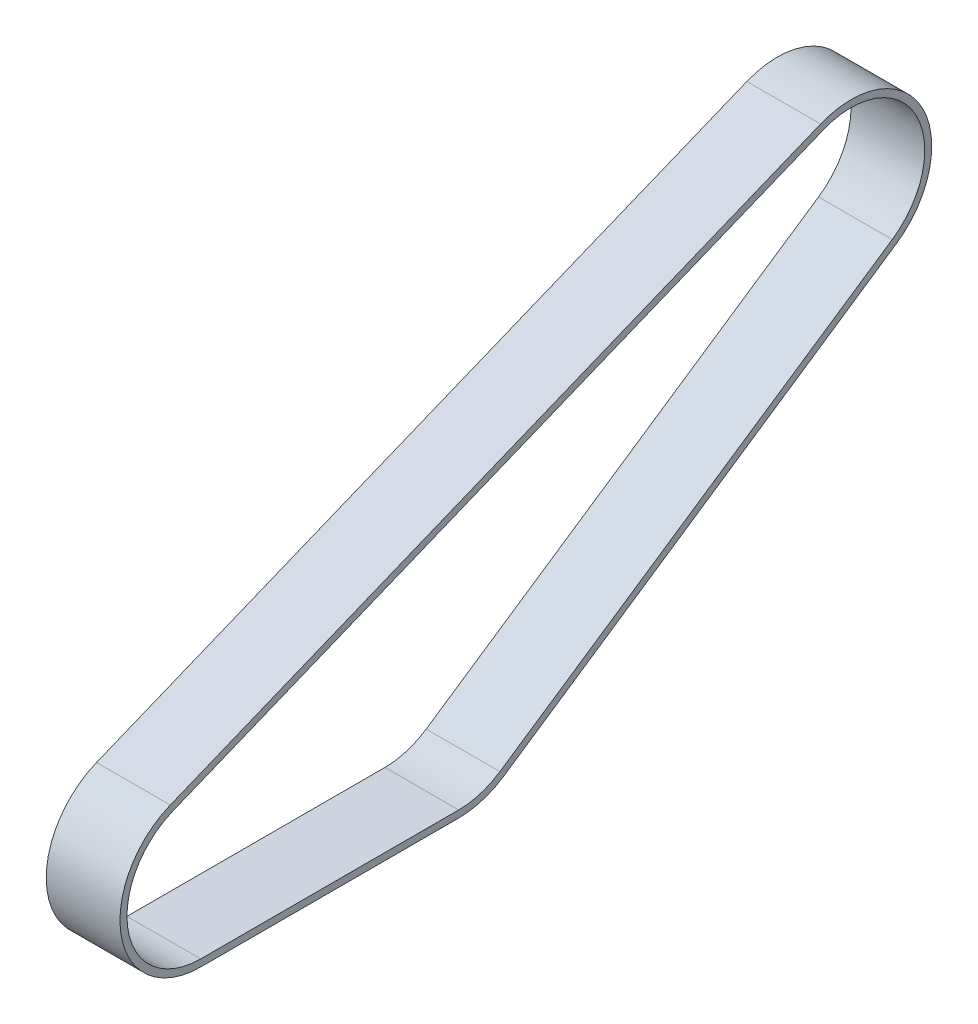
ISO-10303-21;
HEADER;
FILE_DESCRIPTION(('STEP AP214'),'2;1');
FILE_NAME('part.step','',(''),(''),'','','');
FILE_SCHEMA(('AUTOMOTIVE_DESIGN { 1 0 10303 214 1 1 1 1 }'));
ENDSEC;
DATA;
#1=APPLICATION_CONTEXT('core data for automotive mechanical design processes');
#2=APPLICATION_PROTOCOL_DEFINITION('international standard','automotive_design',2000,#1);
#3=PRODUCT_CONTEXT('',#1,'mechanical');
#4=PRODUCT('Part','Part','',(#3));
#5=PRODUCT_RELATED_PRODUCT_CATEGORY('part','',(#4));
#6=PRODUCT_DEFINITION_FORMATION('','',#4);
#7=PRODUCT_DEFINITION_CONTEXT('part definition',#1,'design');
#8=PRODUCT_DEFINITION('design','',#6,#7);
#9=PRODUCT_DEFINITION_SHAPE('','',#8);
#10=(LENGTH_UNIT() NAMED_UNIT(*) SI_UNIT(.MILLI.,.METRE.));
#11=(NAMED_UNIT(*) PLANE_ANGLE_UNIT() SI_UNIT($,.RADIAN.));
#12=(NAMED_UNIT(*) SI_UNIT($,.STERADIAN.) SOLID_ANGLE_UNIT());
#13=UNCERTAINTY_MEASURE_WITH_UNIT(LENGTH_MEASURE(1.E-05),#10,'distance_accuracy_value','');
#14=(GEOMETRIC_REPRESENTATION_CONTEXT(3) GLOBAL_UNCERTAINTY_ASSIGNED_CONTEXT((#13)) GLOBAL_UNIT_ASSIGNED_CONTEXT((#10,
#11,#12)) REPRESENTATION_CONTEXT('',''));
#15=CARTESIAN_POINT('',(0.,0.,0.));
#16=DIRECTION('',(0.,0.,1.));
#17=DIRECTION('',(1.,0.,0.));
#18=AXIS2_PLACEMENT_3D('',#15,#16,#17);
#19=CARTESIAN_POINT('',(50.,0.,47.4047747788869));
#20=DIRECTION('',(1.,0.,0.));
#21=DIRECTION('',(0.,0.,-1.));
#22=AXIS2_PLACEMENT_3D('',#19,#20,#21);
#23=PLANE('',#22);
#24=CARTESIAN_POINT('',(50.,0.,47.4047747788869));
#25=DIRECTION('',(1.,0.,0.));
#26=DIRECTION('',(0.,0.,-1.));
#27=AXIS2_PLACEMENT_3D('',#24,#25,#26);
#28=CIRCLE('',#27,54.752);
#29=CARTESIAN_POINT('',(50.,50.7140634409103,68.0412781966494));
#30=VERTEX_POINT('',#29);
#31=CARTESIAN_POINT('',(50.,-54.752,47.4047747788869));
#32=VERTEX_POINT('',#31);
#33=EDGE_CURVE('E176',#30,#32,#28,.T.);
#34=ORIENTED_EDGE('',*,*,#33,.T.);
#35=DIRECTION('',(0.,0.,-1.));
#36=VECTOR('',#35,1.);
#37=CARTESIAN_POINT('',(50.,-54.752,47.4047747788869));
#38=LINE('',#37,#36);
#39=CARTESIAN_POINT('',(50.,-54.752,-127.595225221113));
#40=VERTEX_POINT('',#39);
#41=EDGE_CURVE('E179',#32,#40,#38,.T.);
#42=ORIENTED_EDGE('',*,*,#41,.T.);
#43=CARTESIAN_POINT('',(50.,0.,-127.595225221113));
#44=DIRECTION('',(1.,0.,0.));
#45=DIRECTION('',(0.,0.,-1.));
#46=AXIS2_PLACEMENT_3D('',#43,#44,#45);
#47=CIRCLE('',#46,54.752);
#48=CARTESIAN_POINT('',(50.,-45.3914815014372,-158.212130863335));
#49=VERTEX_POINT('',#48);
#50=EDGE_CURVE('E182',#40,#49,#47,.T.);
#51=ORIENTED_EDGE('',*,*,#50,.T.);
#52=DIRECTION('',(0.,0.559192461320526,-0.82903787078896));
#53=VECTOR('',#52,1.);
#54=CARTESIAN_POINT('',(50.,-45.3914815014372,-158.212130863335));
#55=LINE('',#54,#53);
#56=CARTESIAN_POINT('',(50.,134.108518498563,-424.332130863334));
#57=VERTEX_POINT('',#56);
#58=EDGE_CURVE('E184',#49,#57,#55,.T.);
#59=ORIENTED_EDGE('',*,*,#58,.T.);
#60=CARTESIAN_POINT('',(50.,179.5,-393.715225221113));
#61=DIRECTION('',(1.,0.,0.));
#62=DIRECTION('',(0.,0.,-1.));
#63=AXIS2_PLACEMENT_3D('',#60,#61,#62);
#64=CIRCLE('',#63,54.752);
#65=CARTESIAN_POINT('',(50.,230.21406344091,-373.078721803351));
#66=VERTEX_POINT('',#65);
#67=EDGE_CURVE('E186',#57,#66,#64,.T.);
#68=ORIENTED_EDGE('',*,*,#67,.T.);
#69=DIRECTION('',(0.,-0.376908668500923,0.926250428128841));
#70=VECTOR('',#69,1.);
#71=CARTESIAN_POINT('',(50.,50.7140634409103,68.0412781966494));
#72=LINE('',#71,#70);
#73=EDGE_CURVE('E188',#66,#30,#72,.T.);
#74=ORIENTED_EDGE('',*,*,#73,.T.);
#75=EDGE_LOOP('',(#34,#42,#51,#59,#68,#74));
#76=FACE_BOUND('',#75,.T.);
#77=DIRECTION('',(0.,-0.376908668500922,0.926250428128841));
#78=VECTOR('',#77,1.);
#79=CARTESIAN_POINT('',(50.,46.3125214064421,66.250208203933));
#80=LINE('',#79,#78);
#81=CARTESIAN_POINT('',(50.,225.812521406442,-374.869791796067));
#82=VERTEX_POINT('',#81);
#83=CARTESIAN_POINT('',(50.,46.3125214064421,66.250208203933));
#84=VERTEX_POINT('',#83);
#85=EDGE_CURVE('E133',#82,#84,#80,.T.);
#86=ORIENTED_EDGE('',*,*,#85,.F.);
#87=CARTESIAN_POINT('',(50.,179.5,-393.715225221113));
#88=DIRECTION('',(1.,0.,0.));
#89=DIRECTION('',(0.,0.,-1.));
#90=AXIS2_PLACEMENT_3D('',#87,#88,#89);
#91=CIRCLE('',#90,50.);
#92=CARTESIAN_POINT('',(50.,138.048106460552,-421.674848287139));
#93=VERTEX_POINT('',#92);
#94=EDGE_CURVE('E125',#93,#82,#91,.T.);
#95=ORIENTED_EDGE('',*,*,#94,.F.);
#96=DIRECTION('',(0.,0.559192461320526,-0.82903787078896));
#97=VECTOR('',#96,1.);
#98=CARTESIAN_POINT('',(50.,-41.451893539448,-155.554848287139));
#99=LINE('',#98,#97);
#100=CARTESIAN_POINT('',(50.,-41.451893539448,-155.554848287139));
#101=VERTEX_POINT('',#100);
#102=EDGE_CURVE('E154',#101,#93,#99,.T.);
#103=ORIENTED_EDGE('',*,*,#102,.F.);
#104=CARTESIAN_POINT('',(50.,0.,-127.595225221113));
#105=DIRECTION('',(1.,0.,0.));
#106=DIRECTION('',(0.,0.,-1.));
#107=AXIS2_PLACEMENT_3D('',#104,#105,#106);
#108=CIRCLE('',#107,50.);
#109=CARTESIAN_POINT('',(50.,-50.,-127.595225221113));
#110=VERTEX_POINT('',#109);
#111=EDGE_CURVE('E152',#110,#101,#108,.T.);
#112=ORIENTED_EDGE('',*,*,#111,.F.);
#113=DIRECTION('',(0.,0.,-1.));
#114=VECTOR('',#113,1.);
#115=CARTESIAN_POINT('',(50.,-50.,47.4047747788869));
#116=LINE('',#115,#114);
#117=CARTESIAN_POINT('',(50.,-50.,47.4047747788869));
#118=VERTEX_POINT('',#117);
#119=EDGE_CURVE('E148',#118,#110,#116,.T.);
#120=ORIENTED_EDGE('',*,*,#119,.F.);
#121=CARTESIAN_POINT('',(50.,0.,47.4047747788869));
#122=DIRECTION('',(1.,0.,0.));
#123=DIRECTION('',(0.,0.,-1.));
#124=AXIS2_PLACEMENT_3D('',#121,#122,#123);
#125=CIRCLE('',#124,50.);
#126=EDGE_CURVE('E146',#84,#118,#125,.T.);
#127=ORIENTED_EDGE('',*,*,#126,.F.);
#128=EDGE_LOOP('',(#86,#95,#103,#112,#120,#127));
#129=FACE_BOUND('',#128,.T.);
#130=ADVANCED_FACE('F36',(#76,#129),#23,.T.);
#131=CARTESIAN_POINT('',(0.,0.,47.4047747788869));
#132=DIRECTION('',(1.,0.,0.));
#133=DIRECTION('',(0.,0.,-1.));
#134=AXIS2_PLACEMENT_3D('',#131,#132,#133);
#135=PLANE('',#134);
#136=CARTESIAN_POINT('',(0.,0.,47.4047747788869));
#137=DIRECTION('',(1.,0.,0.));
#138=DIRECTION('',(0.,0.,-1.));
#139=AXIS2_PLACEMENT_3D('',#136,#137,#138);
#140=CIRCLE('',#139,54.752);
#141=CARTESIAN_POINT('',(0.,50.7140634409103,68.0412781966494));
#142=VERTEX_POINT('',#141);
#143=CARTESIAN_POINT('',(0.,-54.752,47.4047747788869));
#144=VERTEX_POINT('',#143);
#145=EDGE_CURVE('E141',#142,#144,#140,.T.);
#146=ORIENTED_EDGE('',*,*,#145,.F.);
#147=DIRECTION('',(0.,-0.376908668500923,0.926250428128841));
#148=VECTOR('',#147,1.);
#149=CARTESIAN_POINT('',(0.,50.7140634409103,68.0412781966494));
#150=LINE('',#149,#148);
#151=CARTESIAN_POINT('',(0.,230.21406344091,-373.078721803351));
#152=VERTEX_POINT('',#151);
#153=EDGE_CURVE('E180',#152,#142,#150,.T.);
#154=ORIENTED_EDGE('',*,*,#153,.F.);
#155=CARTESIAN_POINT('',(0.,179.5,-393.715225221113));
#156=DIRECTION('',(1.,0.,0.));
#157=DIRECTION('',(0.,0.,-1.));
#158=AXIS2_PLACEMENT_3D('',#155,#156,#157);
#159=CIRCLE('',#158,54.752);
#160=CARTESIAN_POINT('',(0.,134.108518498563,-424.332130863334));
#161=VERTEX_POINT('',#160);
#162=EDGE_CURVE('E199',#161,#152,#159,.T.);
#163=ORIENTED_EDGE('',*,*,#162,.F.);
#164=DIRECTION('',(0.,0.559192461320526,-0.82903787078896));
#165=VECTOR('',#164,1.);
#166=CARTESIAN_POINT('',(0.,-45.3914815014372,-158.212130863335));
#167=LINE('',#166,#165);
#168=CARTESIAN_POINT('',(0.,-45.3914815014372,-158.212130863335));
#169=VERTEX_POINT('',#168);
#170=EDGE_CURVE('E197',#169,#161,#167,.T.);
#171=ORIENTED_EDGE('',*,*,#170,.F.);
#172=CARTESIAN_POINT('',(0.,0.,-127.595225221113));
#173=DIRECTION('',(1.,0.,0.));
#174=DIRECTION('',(0.,0.,-1.));
#175=AXIS2_PLACEMENT_3D('',#172,#173,#174);
#176=CIRCLE('',#175,54.752);
#177=CARTESIAN_POINT('',(0.,-54.752,-127.595225221113));
#178=VERTEX_POINT('',#177);
#179=EDGE_CURVE('E195',#178,#169,#176,.T.);
#180=ORIENTED_EDGE('',*,*,#179,.F.);
#181=DIRECTION('',(0.,0.,-1.));
#182=VECTOR('',#181,1.);
#183=CARTESIAN_POINT('',(0.,-54.752,47.4047747788869));
#184=LINE('',#183,#182);
#185=EDGE_CURVE('E193',#144,#178,#184,.T.);
#186=ORIENTED_EDGE('',*,*,#185,.F.);
#187=EDGE_LOOP('',(#146,#154,#163,#171,#180,#186));
#188=FACE_BOUND('',#187,.T.);
#189=CARTESIAN_POINT('',(0.,179.5,-393.715225221113));
#190=DIRECTION('',(1.,0.,0.));
#191=DIRECTION('',(0.,0.,-1.));
#192=AXIS2_PLACEMENT_3D('',#189,#190,#191);
#193=CIRCLE('',#192,50.);
#194=CARTESIAN_POINT('',(0.,138.048106460552,-421.674848287139));
#195=VERTEX_POINT('',#194);
#196=CARTESIAN_POINT('',(0.,225.812521406442,-374.869791796067));
#197=VERTEX_POINT('',#196);
#198=EDGE_CURVE('E59',#195,#197,#193,.T.);
#199=ORIENTED_EDGE('',*,*,#198,.T.);
#200=DIRECTION('',(0.,-0.376908668500922,0.926250428128841));
#201=VECTOR('',#200,1.);
#202=CARTESIAN_POINT('',(0.,46.3125214064421,66.250208203933));
#203=LINE('',#202,#201);
#204=CARTESIAN_POINT('',(0.,46.3125214064421,66.250208203933));
#205=VERTEX_POINT('',#204);
#206=EDGE_CURVE('E140',#197,#205,#203,.T.);
#207=ORIENTED_EDGE('',*,*,#206,.T.);
#208=CARTESIAN_POINT('',(0.,0.,47.4047747788869));
#209=DIRECTION('',(1.,0.,0.));
#210=DIRECTION('',(0.,0.,-1.));
#211=AXIS2_PLACEMENT_3D('',#208,#209,#210);
#212=CIRCLE('',#211,50.);
#213=CARTESIAN_POINT('',(0.,-50.,47.4047747788869));
#214=VERTEX_POINT('',#213);
#215=EDGE_CURVE('E158',#205,#214,#212,.T.);
#216=ORIENTED_EDGE('',*,*,#215,.T.);
#217=DIRECTION('',(0.,0.,-1.));
#218=VECTOR('',#217,1.);
#219=CARTESIAN_POINT('',(0.,-50.,47.4047747788869));
#220=LINE('',#219,#218);
#221=CARTESIAN_POINT('',(0.,-50.,-127.595225221113));
#222=VERTEX_POINT('',#221);
#223=EDGE_CURVE('E161',#214,#222,#220,.T.);
#224=ORIENTED_EDGE('',*,*,#223,.T.);
#225=CARTESIAN_POINT('',(0.,0.,-127.595225221113));
#226=DIRECTION('',(1.,0.,0.));
#227=DIRECTION('',(0.,0.,-1.));
#228=AXIS2_PLACEMENT_3D('',#225,#226,#227);
#229=CIRCLE('',#228,50.);
#230=CARTESIAN_POINT('',(0.,-41.451893539448,-155.554848287139));
#231=VERTEX_POINT('',#230);
#232=EDGE_CURVE('E164',#222,#231,#229,.T.);
#233=ORIENTED_EDGE('',*,*,#232,.T.);
#234=DIRECTION('',(0.,0.559192461320526,-0.82903787078896));
#235=VECTOR('',#234,1.);
#236=CARTESIAN_POINT('',(0.,-41.451893539448,-155.554848287139));
#237=LINE('',#236,#235);
#238=EDGE_CURVE('E134',#231,#195,#237,.T.);
#239=ORIENTED_EDGE('',*,*,#238,.T.);
#240=EDGE_LOOP('',(#199,#207,#216,#224,#233,#239));
#241=FACE_BOUND('',#240,.T.);
#242=ADVANCED_FACE('F223',(#188,#241),#135,.F.);
#243=CARTESIAN_POINT('',(50.,0.,47.4047747788869));
#244=DIRECTION('',(-1.,0.,0.));
#245=DIRECTION('',(0.,0.,1.));
#246=AXIS2_PLACEMENT_3D('',#243,#244,#245);
#247=CYLINDRICAL_SURFACE('',#246,54.752);
#248=ORIENTED_EDGE('',*,*,#145,.T.);
#249=DIRECTION('',(-1.,0.,0.));
#250=VECTOR('',#249,1.);
#251=CARTESIAN_POINT('',(50.,-54.752,47.4047747788869));
#252=LINE('',#251,#250);
#253=EDGE_CURVE('E11',#32,#144,#252,.T.);
#254=ORIENTED_EDGE('',*,*,#253,.F.);
#255=ORIENTED_EDGE('',*,*,#33,.F.);
#256=DIRECTION('',(-1.,0.,0.));
#257=VECTOR('',#256,1.);
#258=CARTESIAN_POINT('',(50.,50.7140634409103,68.0412781966494));
#259=LINE('',#258,#257);
#260=EDGE_CURVE('E190',#30,#142,#259,.T.);
#261=ORIENTED_EDGE('',*,*,#260,.T.);
#262=EDGE_LOOP('',(#248,#254,#255,#261));
#263=FACE_BOUND('',#262,.T.);
#264=ADVANCED_FACE('F38',(#263),#247,.T.);
#265=CARTESIAN_POINT('',(50.,-54.752,47.4047747788869));
#266=DIRECTION('',(0.,1.,0.));
#267=DIRECTION('',(0.,0.,1.));
#268=AXIS2_PLACEMENT_3D('',#265,#266,#267);
#269=PLANE('',#268);
#270=ORIENTED_EDGE('',*,*,#185,.T.);
#271=DIRECTION('',(-1.,0.,0.));
#272=VECTOR('',#271,1.);
#273=CARTESIAN_POINT('',(50.,-54.752,-127.595225221113));
#274=LINE('',#273,#272);
#275=EDGE_CURVE('E44',#40,#178,#274,.T.);
#276=ORIENTED_EDGE('',*,*,#275,.F.);
#277=ORIENTED_EDGE('',*,*,#41,.F.);
#278=ORIENTED_EDGE('',*,*,#253,.T.);
#279=EDGE_LOOP('',(#270,#276,#277,#278));
#280=FACE_BOUND('',#279,.T.);
#281=ADVANCED_FACE('F240',(#280),#269,.F.);
#282=CARTESIAN_POINT('',(50.,0.,-127.595225221113));
#283=DIRECTION('',(-1.,0.,0.));
#284=DIRECTION('',(0.,0.,1.));
#285=AXIS2_PLACEMENT_3D('',#282,#283,#284);
#286=CYLINDRICAL_SURFACE('',#285,54.752);
#287=ORIENTED_EDGE('',*,*,#179,.T.);
#288=DIRECTION('',(-1.,0.,0.));
#289=VECTOR('',#288,1.);
#290=CARTESIAN_POINT('',(50.,-45.3914815014372,-158.212130863335));
#291=LINE('',#290,#289);
#292=EDGE_CURVE('E210',#49,#169,#291,.T.);
#293=ORIENTED_EDGE('',*,*,#292,.F.);
#294=ORIENTED_EDGE('',*,*,#50,.F.);
#295=ORIENTED_EDGE('',*,*,#275,.T.);
#296=EDGE_LOOP('',(#287,#293,#294,#295));
#297=FACE_BOUND('',#296,.T.);
#298=ADVANCED_FACE('F217',(#297),#286,.T.);
#299=CARTESIAN_POINT('',(50.,-45.3914815014372,-158.212130863335));
#300=DIRECTION('',(0.,0.82903787078896,0.559192461320526));
#301=DIRECTION('',(0.,-0.559192461320526,0.82903787078896));
#302=AXIS2_PLACEMENT_3D('',#299,#300,#301);
#303=PLANE('',#302);
#304=ORIENTED_EDGE('',*,*,#170,.T.);
#305=DIRECTION('',(-1.,0.,0.));
#306=VECTOR('',#305,1.);
#307=CARTESIAN_POINT('',(50.,134.108518498563,-424.332130863334));
#308=LINE('',#307,#306);
#309=EDGE_CURVE('E207',#57,#161,#308,.T.);
#310=ORIENTED_EDGE('',*,*,#309,.F.);
#311=ORIENTED_EDGE('',*,*,#58,.F.);
#312=ORIENTED_EDGE('',*,*,#292,.T.);
#313=EDGE_LOOP('',(#304,#310,#311,#312));
#314=FACE_BOUND('',#313,.T.);
#315=ADVANCED_FACE('F229',(#314),#303,.F.);
#316=CARTESIAN_POINT('',(50.,179.5,-393.715225221113));
#317=DIRECTION('',(-1.,0.,0.));
#318=DIRECTION('',(0.,0.,1.));
#319=AXIS2_PLACEMENT_3D('',#316,#317,#318);
#320=CYLINDRICAL_SURFACE('',#319,54.752);
#321=ORIENTED_EDGE('',*,*,#162,.T.);
#322=DIRECTION('',(-1.,0.,0.));
#323=VECTOR('',#322,1.);
#324=CARTESIAN_POINT('',(50.,230.21406344091,-373.078721803351));
#325=LINE('',#324,#323);
#326=EDGE_CURVE('E204',#66,#152,#325,.T.);
#327=ORIENTED_EDGE('',*,*,#326,.F.);
#328=ORIENTED_EDGE('',*,*,#67,.F.);
#329=ORIENTED_EDGE('',*,*,#309,.T.);
#330=EDGE_LOOP('',(#321,#327,#328,#329));
#331=FACE_BOUND('',#330,.T.);
#332=ADVANCED_FACE('F233',(#331),#320,.T.);
#333=CARTESIAN_POINT('',(50.,50.7140634409103,68.0412781966494));
#334=DIRECTION('',(0.,-0.926250428128841,-0.376908668500923));
#335=DIRECTION('',(0.,0.376908668500923,-0.926250428128841));
#336=AXIS2_PLACEMENT_3D('',#333,#334,#335);
#337=PLANE('',#336);
#338=ORIENTED_EDGE('',*,*,#153,.T.);
#339=ORIENTED_EDGE('',*,*,#260,.F.);
#340=ORIENTED_EDGE('',*,*,#73,.F.);
#341=ORIENTED_EDGE('',*,*,#326,.T.);
#342=EDGE_LOOP('',(#338,#339,#340,#341));
#343=FACE_BOUND('',#342,.T.);
#344=ADVANCED_FACE('F243',(#343),#337,.F.);
#345=CARTESIAN_POINT('',(50.,179.5,-393.715225221113));
#346=DIRECTION('',(-1.,0.,0.));
#347=DIRECTION('',(0.,0.,1.));
#348=AXIS2_PLACEMENT_3D('',#345,#346,#347);
#349=CYLINDRICAL_SURFACE('',#348,50.);
#350=ORIENTED_EDGE('',*,*,#198,.F.);
#351=DIRECTION('',(-1.,0.,0.));
#352=VECTOR('',#351,1.);
#353=CARTESIAN_POINT('',(50.,138.048106460552,-421.674848287139));
#354=LINE('',#353,#352);
#355=EDGE_CURVE('E129',#93,#195,#354,.T.);
#356=ORIENTED_EDGE('',*,*,#355,.F.);
#357=ORIENTED_EDGE('',*,*,#94,.T.);
#358=DIRECTION('',(-1.,0.,0.));
#359=VECTOR('',#358,1.);
#360=CARTESIAN_POINT('',(50.,225.812521406442,-374.869791796067));
#361=LINE('',#360,#359);
#362=EDGE_CURVE('E128',#82,#197,#361,.T.);
#363=ORIENTED_EDGE('',*,*,#362,.T.);
#364=EDGE_LOOP('',(#350,#356,#357,#363));
#365=FACE_BOUND('',#364,.T.);
#366=ADVANCED_FACE('F127',(#365),#349,.F.);
#367=CARTESIAN_POINT('',(50.,46.3125214064421,66.250208203933));
#368=DIRECTION('',(0.,-0.926250428128841,-0.376908668500923));
#369=DIRECTION('',(0.,0.376908668500923,-0.926250428128841));
#370=AXIS2_PLACEMENT_3D('',#367,#368,#369);
#371=PLANE('',#370);
#372=ORIENTED_EDGE('',*,*,#206,.F.);
#373=ORIENTED_EDGE('',*,*,#362,.F.);
#374=ORIENTED_EDGE('',*,*,#85,.T.);
#375=DIRECTION('',(-1.,0.,0.));
#376=VECTOR('',#375,1.);
#377=CARTESIAN_POINT('',(50.,46.3125214064421,66.250208203933));
#378=LINE('',#377,#376);
#379=EDGE_CURVE('E142',#84,#205,#378,.T.);
#380=ORIENTED_EDGE('',*,*,#379,.T.);
#381=EDGE_LOOP('',(#372,#373,#374,#380));
#382=FACE_BOUND('',#381,.T.);
#383=ADVANCED_FACE('F137',(#382),#371,.T.);
#384=CARTESIAN_POINT('',(50.,0.,47.4047747788869));
#385=DIRECTION('',(-1.,0.,0.));
#386=DIRECTION('',(0.,0.,1.));
#387=AXIS2_PLACEMENT_3D('',#384,#385,#386);
#388=CYLINDRICAL_SURFACE('',#387,50.);
#389=ORIENTED_EDGE('',*,*,#215,.F.);
#390=ORIENTED_EDGE('',*,*,#379,.F.);
#391=ORIENTED_EDGE('',*,*,#126,.T.);
#392=DIRECTION('',(-1.,0.,0.));
#393=VECTOR('',#392,1.);
#394=CARTESIAN_POINT('',(50.,-50.,47.4047747788869));
#395=LINE('',#394,#393);
#396=EDGE_CURVE('E173',#118,#214,#395,.T.);
#397=ORIENTED_EDGE('',*,*,#396,.T.);
#398=EDGE_LOOP('',(#389,#390,#391,#397));
#399=FACE_BOUND('',#398,.T.);
#400=ADVANCED_FACE('F261',(#399),#388,.F.);
#401=CARTESIAN_POINT('',(50.,-50.,47.4047747788869));
#402=DIRECTION('',(0.,1.,0.));
#403=DIRECTION('',(0.,0.,1.));
#404=AXIS2_PLACEMENT_3D('',#401,#402,#403);
#405=PLANE('',#404);
#406=ORIENTED_EDGE('',*,*,#223,.F.);
#407=ORIENTED_EDGE('',*,*,#396,.F.);
#408=ORIENTED_EDGE('',*,*,#119,.T.);
#409=DIRECTION('',(-1.,0.,0.));
#410=VECTOR('',#409,1.);
#411=CARTESIAN_POINT('',(50.,-50.,-127.595225221113));
#412=LINE('',#411,#410);
#413=EDGE_CURVE('E171',#110,#222,#412,.T.);
#414=ORIENTED_EDGE('',*,*,#413,.T.);
#415=EDGE_LOOP('',(#406,#407,#408,#414));
#416=FACE_BOUND('',#415,.T.);
#417=ADVANCED_FACE('F264',(#416),#405,.T.);
#418=CARTESIAN_POINT('',(50.,0.,-127.595225221113));
#419=DIRECTION('',(-1.,0.,0.));
#420=DIRECTION('',(0.,0.,1.));
#421=AXIS2_PLACEMENT_3D('',#418,#419,#420);
#422=CYLINDRICAL_SURFACE('',#421,50.);
#423=ORIENTED_EDGE('',*,*,#232,.F.);
#424=ORIENTED_EDGE('',*,*,#413,.F.);
#425=ORIENTED_EDGE('',*,*,#111,.T.);
#426=DIRECTION('',(-1.,0.,0.));
#427=VECTOR('',#426,1.);
#428=CARTESIAN_POINT('',(50.,-41.451893539448,-155.554848287139));
#429=LINE('',#428,#427);
#430=EDGE_CURVE('E51',#101,#231,#429,.T.);
#431=ORIENTED_EDGE('',*,*,#430,.T.);
#432=EDGE_LOOP('',(#423,#424,#425,#431));
#433=FACE_BOUND('',#432,.T.);
#434=ADVANCED_FACE('F268',(#433),#422,.F.);
#435=CARTESIAN_POINT('',(50.,-41.451893539448,-155.554848287139));
#436=DIRECTION('',(0.,0.82903787078896,0.559192461320526));
#437=DIRECTION('',(0.,-0.559192461320526,0.82903787078896));
#438=AXIS2_PLACEMENT_3D('',#435,#436,#437);
#439=PLANE('',#438);
#440=ORIENTED_EDGE('',*,*,#238,.F.);
#441=ORIENTED_EDGE('',*,*,#430,.F.);
#442=ORIENTED_EDGE('',*,*,#102,.T.);
#443=ORIENTED_EDGE('',*,*,#355,.T.);
#444=EDGE_LOOP('',(#440,#441,#442,#443));
#445=FACE_BOUND('',#444,.T.);
#446=ADVANCED_FACE('F272',(#445),#439,.T.);
#447=CLOSED_SHELL('',(#130,#242,#264,#281,#298,#315,#332,#344,#366,#383,#400,#417,#434,#446));
#448=MANIFOLD_SOLID_BREP('B2',#447);
#449=ADVANCED_BREP_SHAPE_REPRESENTATION('',(#18,#448),#14);
#450=SHAPE_DEFINITION_REPRESENTATION(#9,#449);
ENDSEC;
END-ISO-10303-21;
